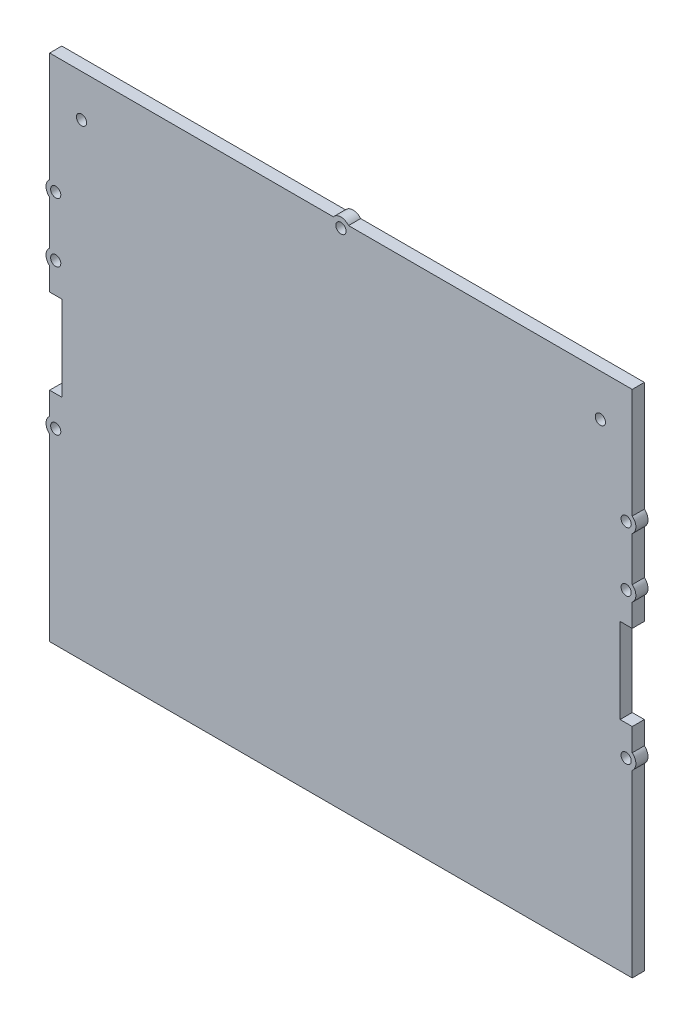
ISO-10303-21;
HEADER;
FILE_DESCRIPTION(('STEP AP214'),'2;1');
FILE_NAME('part.step','',(''),(''),'','','');
FILE_SCHEMA(('AUTOMOTIVE_DESIGN { 1 0 10303 214 1 1 1 1 }'));
ENDSEC;
DATA;
#1=APPLICATION_CONTEXT('core data for automotive mechanical design processes');
#2=APPLICATION_PROTOCOL_DEFINITION('international standard','automotive_design',2000,#1);
#3=PRODUCT_CONTEXT('',#1,'mechanical');
#4=PRODUCT('Part','Part','',(#3));
#5=PRODUCT_RELATED_PRODUCT_CATEGORY('part','',(#4));
#6=PRODUCT_DEFINITION_FORMATION('','',#4);
#7=PRODUCT_DEFINITION_CONTEXT('part definition',#1,'design');
#8=PRODUCT_DEFINITION('design','',#6,#7);
#9=PRODUCT_DEFINITION_SHAPE('','',#8);
#10=(LENGTH_UNIT() NAMED_UNIT(*) SI_UNIT(.MILLI.,.METRE.));
#11=(NAMED_UNIT(*) PLANE_ANGLE_UNIT() SI_UNIT($,.RADIAN.));
#12=(NAMED_UNIT(*) SI_UNIT($,.STERADIAN.) SOLID_ANGLE_UNIT());
#13=UNCERTAINTY_MEASURE_WITH_UNIT(LENGTH_MEASURE(1.E-05),#10,'distance_accuracy_value','');
#14=(GEOMETRIC_REPRESENTATION_CONTEXT(3) GLOBAL_UNCERTAINTY_ASSIGNED_CONTEXT((#13)) GLOBAL_UNIT_ASSIGNED_CONTEXT((#10,
#11,#12)) REPRESENTATION_CONTEXT('',''));
#15=CARTESIAN_POINT('',(0.,0.,0.));
#16=DIRECTION('',(0.,0.,1.));
#17=DIRECTION('',(1.,0.,0.));
#18=AXIS2_PLACEMENT_3D('',#15,#16,#17);
#19=CARTESIAN_POINT('',(-120.,40.,5.));
#20=DIRECTION('',(1.,0.,0.));
#21=DIRECTION('',(0.,0.,-1.));
#22=AXIS2_PLACEMENT_3D('',#19,#20,#21);
#23=PLANE('',#22);
#24=DIRECTION('',(0.,-1.,0.));
#25=VECTOR('',#24,1.);
#26=CARTESIAN_POINT('',(-120.,40.,0.));
#27=LINE('',#26,#25);
#28=CARTESIAN_POINT('',(-120.,105.,0.));
#29=VERTEX_POINT('',#28);
#30=CARTESIAN_POINT('',(-120.,59.7824514060019,0.));
#31=VERTEX_POINT('',#30);
#32=EDGE_CURVE('E218',#29,#31,#27,.T.);
#33=ORIENTED_EDGE('',*,*,#32,.T.);
#34=DIRECTION('',(0.,0.,1.));
#35=VECTOR('',#34,1.);
#36=CARTESIAN_POINT('',(-120.,59.7824514060019,0.));
#37=LINE('',#36,#35);
#38=CARTESIAN_POINT('',(-120.,59.7824514060019,5.));
#39=VERTEX_POINT('',#38);
#40=EDGE_CURVE('E56',#31,#39,#37,.T.);
#41=ORIENTED_EDGE('',*,*,#40,.T.);
#42=DIRECTION('',(0.,-1.,0.));
#43=VECTOR('',#42,1.);
#44=CARTESIAN_POINT('',(-120.,-40.,5.));
#45=LINE('',#44,#43);
#46=CARTESIAN_POINT('',(-120.,105.,5.));
#47=VERTEX_POINT('',#46);
#48=EDGE_CURVE('E406',#47,#39,#45,.T.);
#49=ORIENTED_EDGE('',*,*,#48,.F.);
#50=DIRECTION('',(0.,0.,-1.));
#51=VECTOR('',#50,1.);
#52=CARTESIAN_POINT('',(-120.,105.,5.));
#53=LINE('',#52,#51);
#54=EDGE_CURVE('E421',#47,#29,#53,.T.);
#55=ORIENTED_EDGE('',*,*,#54,.T.);
#56=EDGE_LOOP('',(#33,#41,#49,#55));
#57=FACE_BOUND('',#56,.T.);
#58=ADVANCED_FACE('F33',(#57),#23,.F.);
#59=CARTESIAN_POINT('',(-120.,53.5374534076008,5.));
#60=VERTEX_POINT('',#59);
#61=CARTESIAN_POINT('',(-120.,35.3372333567552,5.));
#62=VERTEX_POINT('',#61);
#63=EDGE_CURVE('E48',#60,#62,#45,.T.);
#64=ORIENTED_EDGE('',*,*,#63,.F.);
#65=DIRECTION('',(0.,0.,1.));
#66=VECTOR('',#65,1.);
#67=CARTESIAN_POINT('',(-120.,53.5374534076008,0.));
#68=LINE('',#67,#66);
#69=CARTESIAN_POINT('',(-120.,53.5374534076008,0.));
#70=VERTEX_POINT('',#69);
#71=EDGE_CURVE('E221',#70,#60,#68,.T.);
#72=ORIENTED_EDGE('',*,*,#71,.F.);
#73=CARTESIAN_POINT('',(-120.,35.3372333567552,0.));
#74=VERTEX_POINT('',#73);
#75=EDGE_CURVE('E208',#70,#74,#27,.T.);
#76=ORIENTED_EDGE('',*,*,#75,.T.);
#77=DIRECTION('',(0.,0.,1.));
#78=VECTOR('',#77,1.);
#79=CARTESIAN_POINT('',(-120.,35.3372333567552,0.));
#80=LINE('',#79,#78);
#81=EDGE_CURVE('E238',#74,#62,#80,.T.);
#82=ORIENTED_EDGE('',*,*,#81,.T.);
#83=EDGE_LOOP('',(#64,#72,#76,#82));
#84=FACE_BOUND('',#83,.T.);
#85=ADVANCED_FACE('F222',(#84),#23,.F.);
#86=CARTESIAN_POINT('',(-120.,-15.2852656424439,0.));
#87=VERTEX_POINT('',#86);
#88=CARTESIAN_POINT('',(-120.,-24.6627666432447,0.));
#89=VERTEX_POINT('',#88);
#90=EDGE_CURVE('E434',#87,#89,#27,.T.);
#91=ORIENTED_EDGE('',*,*,#90,.T.);
#92=DIRECTION('',(0.,0.,1.));
#93=VECTOR('',#92,1.);
#94=CARTESIAN_POINT('',(-120.,-24.6627666432447,0.));
#95=LINE('',#94,#93);
#96=CARTESIAN_POINT('',(-120.,-24.6627666432447,5.));
#97=VERTEX_POINT('',#96);
#98=EDGE_CURVE('E249',#89,#97,#95,.T.);
#99=ORIENTED_EDGE('',*,*,#98,.T.);
#100=CARTESIAN_POINT('',(-120.,-15.2852656424439,5.));
#101=VERTEX_POINT('',#100);
#102=EDGE_CURVE('E409',#101,#97,#45,.T.);
#103=ORIENTED_EDGE('',*,*,#102,.F.);
#104=DIRECTION('',(0.,0.,1.));
#105=VECTOR('',#104,1.);
#106=CARTESIAN_POINT('',(-120.,-15.2852656424439,0.));
#107=LINE('',#106,#105);
#108=EDGE_CURVE('E359',#87,#101,#107,.T.);
#109=ORIENTED_EDGE('',*,*,#108,.F.);
#110=EDGE_LOOP('',(#91,#99,#103,#109));
#111=FACE_BOUND('',#110,.T.);
#112=ADVANCED_FACE('F485',(#111),#23,.F.);
#113=CARTESIAN_POINT('',(120.,105.,5.));
#114=DIRECTION('',(0.,-1.,0.));
#115=DIRECTION('',(1.,0.,0.));
#116=AXIS2_PLACEMENT_3D('',#113,#114,#115);
#117=PLANE('',#116);
#118=DIRECTION('',(-1.,0.,0.));
#119=VECTOR('',#118,1.);
#120=CARTESIAN_POINT('',(120.,105.,0.));
#121=LINE('',#120,#119);
#122=CARTESIAN_POINT('',(120.,105.,0.));
#123=VERTEX_POINT('',#122);
#124=CARTESIAN_POINT('',(3.12249899919924,105.,0.));
#125=VERTEX_POINT('',#124);
#126=EDGE_CURVE('E430',#123,#125,#121,.T.);
#127=ORIENTED_EDGE('',*,*,#126,.T.);
#128=DIRECTION('',(0.,0.,1.));
#129=VECTOR('',#128,1.);
#130=CARTESIAN_POINT('',(3.12249899919923,105.,0.));
#131=LINE('',#130,#129);
#132=CARTESIAN_POINT('',(3.12249899919924,105.,5.));
#133=VERTEX_POINT('',#132);
#134=EDGE_CURVE('E260',#125,#133,#131,.T.);
#135=ORIENTED_EDGE('',*,*,#134,.T.);
#136=DIRECTION('',(-1.,0.,0.));
#137=VECTOR('',#136,1.);
#138=CARTESIAN_POINT('',(120.,105.,5.));
#139=LINE('',#138,#137);
#140=CARTESIAN_POINT('',(120.,105.,5.));
#141=VERTEX_POINT('',#140);
#142=EDGE_CURVE('E418',#141,#133,#139,.T.);
#143=ORIENTED_EDGE('',*,*,#142,.F.);
#144=DIRECTION('',(0.,0.,-1.));
#145=VECTOR('',#144,1.);
#146=CARTESIAN_POINT('',(120.,105.,5.));
#147=LINE('',#146,#145);
#148=EDGE_CURVE('E437',#141,#123,#147,.T.);
#149=ORIENTED_EDGE('',*,*,#148,.T.);
#150=EDGE_LOOP('',(#127,#135,#143,#149));
#151=FACE_BOUND('',#150,.T.);
#152=ADVANCED_FACE('F502',(#151),#117,.F.);
#153=CARTESIAN_POINT('',(120.,105.,5.));
#154=DIRECTION('',(-1.,0.,0.));
#155=DIRECTION('',(0.,-1.,0.));
#156=AXIS2_PLACEMENT_3D('',#153,#154,#155);
#157=PLANE('',#156);
#158=DIRECTION('',(0.,1.,0.));
#159=VECTOR('',#158,1.);
#160=CARTESIAN_POINT('',(120.,105.,0.));
#161=LINE('',#160,#159);
#162=CARTESIAN_POINT('',(120.,-105.,0.));
#163=VERTEX_POINT('',#162);
#164=CARTESIAN_POINT('',(120.,-30.9077646416431,0.));
#165=VERTEX_POINT('',#164);
#166=EDGE_CURVE('E425',#163,#165,#161,.T.);
#167=ORIENTED_EDGE('',*,*,#166,.T.);
#168=DIRECTION('',(0.,0.,1.));
#169=VECTOR('',#168,1.);
#170=CARTESIAN_POINT('',(120.,-30.9077646416431,0.));
#171=LINE('',#170,#169);
#172=CARTESIAN_POINT('',(120.,-30.9077646416431,5.));
#173=VERTEX_POINT('',#172);
#174=EDGE_CURVE('E271',#165,#173,#171,.T.);
#175=ORIENTED_EDGE('',*,*,#174,.T.);
#176=DIRECTION('',(0.,1.,0.));
#177=VECTOR('',#176,1.);
#178=CARTESIAN_POINT('',(120.,-40.,5.));
#179=LINE('',#178,#177);
#180=CARTESIAN_POINT('',(120.,-105.,5.));
#181=VERTEX_POINT('',#180);
#182=EDGE_CURVE('E412',#181,#173,#179,.T.);
#183=ORIENTED_EDGE('',*,*,#182,.F.);
#184=DIRECTION('',(0.,0.,-1.));
#185=VECTOR('',#184,1.);
#186=CARTESIAN_POINT('',(120.,-105.,5.));
#187=LINE('',#186,#185);
#188=EDGE_CURVE('E41',#181,#163,#187,.T.);
#189=ORIENTED_EDGE('',*,*,#188,.T.);
#190=EDGE_LOOP('',(#167,#175,#183,#189));
#191=FACE_BOUND('',#190,.T.);
#192=ADVANCED_FACE('F443',(#191),#157,.F.);
#193=CARTESIAN_POINT('',(120.,19.7147343575561,0.));
#194=VERTEX_POINT('',#193);
#195=CARTESIAN_POINT('',(120.,29.0922353583569,0.));
#196=VERTEX_POINT('',#195);
#197=EDGE_CURVE('E429',#194,#196,#161,.T.);
#198=ORIENTED_EDGE('',*,*,#197,.T.);
#199=DIRECTION('',(0.,0.,1.));
#200=VECTOR('',#199,1.);
#201=CARTESIAN_POINT('',(120.,29.0922353583569,0.));
#202=LINE('',#201,#200);
#203=CARTESIAN_POINT('',(120.,29.0922353583569,5.));
#204=VERTEX_POINT('',#203);
#205=EDGE_CURVE('E282',#196,#204,#202,.T.);
#206=ORIENTED_EDGE('',*,*,#205,.T.);
#207=CARTESIAN_POINT('',(120.,19.7147343575561,5.));
#208=VERTEX_POINT('',#207);
#209=EDGE_CURVE('E417',#208,#204,#179,.T.);
#210=ORIENTED_EDGE('',*,*,#209,.F.);
#211=DIRECTION('',(0.,0.,1.));
#212=VECTOR('',#211,1.);
#213=CARTESIAN_POINT('',(120.,19.7147343575561,0.));
#214=LINE('',#213,#212);
#215=EDGE_CURVE('E316',#194,#208,#214,.T.);
#216=ORIENTED_EDGE('',*,*,#215,.F.);
#217=EDGE_LOOP('',(#198,#206,#210,#216));
#218=FACE_BOUND('',#217,.T.);
#219=ADVANCED_FACE('F813',(#218),#157,.F.);
#220=CARTESIAN_POINT('',(120.,35.3372333567553,5.));
#221=VERTEX_POINT('',#220);
#222=CARTESIAN_POINT('',(120.,53.5374534076009,5.));
#223=VERTEX_POINT('',#222);
#224=EDGE_CURVE('E799',#221,#223,#179,.T.);
#225=ORIENTED_EDGE('',*,*,#224,.F.);
#226=DIRECTION('',(0.,0.,1.));
#227=VECTOR('',#226,1.);
#228=CARTESIAN_POINT('',(120.,35.3372333567553,0.));
#229=LINE('',#228,#227);
#230=CARTESIAN_POINT('',(120.,35.3372333567553,0.));
#231=VERTEX_POINT('',#230);
#232=EDGE_CURVE('E279',#231,#221,#229,.T.);
#233=ORIENTED_EDGE('',*,*,#232,.F.);
#234=CARTESIAN_POINT('',(120.,53.5374534076009,0.));
#235=VERTEX_POINT('',#234);
#236=EDGE_CURVE('E794',#231,#235,#161,.T.);
#237=ORIENTED_EDGE('',*,*,#236,.T.);
#238=DIRECTION('',(0.,0.,1.));
#239=VECTOR('',#238,1.);
#240=CARTESIAN_POINT('',(120.,53.5374534076009,0.));
#241=LINE('',#240,#239);
#242=EDGE_CURVE('E293',#235,#223,#241,.T.);
#243=ORIENTED_EDGE('',*,*,#242,.T.);
#244=EDGE_LOOP('',(#225,#233,#237,#243));
#245=FACE_BOUND('',#244,.T.);
#246=ADVANCED_FACE('F511',(#245),#157,.F.);
#247=CARTESIAN_POINT('',(120.,59.7824514060019,5.));
#248=VERTEX_POINT('',#247);
#249=EDGE_CURVE('E411',#248,#141,#179,.T.);
#250=ORIENTED_EDGE('',*,*,#249,.F.);
#251=DIRECTION('',(0.,0.,1.));
#252=VECTOR('',#251,1.);
#253=CARTESIAN_POINT('',(120.,59.782451406002,0.));
#254=LINE('',#253,#252);
#255=CARTESIAN_POINT('',(120.,59.782451406002,0.));
#256=VERTEX_POINT('',#255);
#257=EDGE_CURVE('E290',#256,#248,#254,.T.);
#258=ORIENTED_EDGE('',*,*,#257,.F.);
#259=EDGE_CURVE('E424',#256,#123,#161,.T.);
#260=ORIENTED_EDGE('',*,*,#259,.T.);
#261=ORIENTED_EDGE('',*,*,#148,.F.);
#262=EDGE_LOOP('',(#250,#258,#260,#261));
#263=FACE_BOUND('',#262,.T.);
#264=ADVANCED_FACE('F506',(#263),#157,.F.);
#265=CARTESIAN_POINT('',(-120.,29.0922353583569,5.));
#266=VERTEX_POINT('',#265);
#267=CARTESIAN_POINT('',(-120.,19.7147343575561,5.));
#268=VERTEX_POINT('',#267);
#269=EDGE_CURVE('E462',#266,#268,#45,.T.);
#270=ORIENTED_EDGE('',*,*,#269,.F.);
#271=DIRECTION('',(0.,0.,1.));
#272=VECTOR('',#271,1.);
#273=CARTESIAN_POINT('',(-120.,29.0922353583569,0.));
#274=LINE('',#273,#272);
#275=CARTESIAN_POINT('',(-120.,29.0922353583569,0.));
#276=VERTEX_POINT('',#275);
#277=EDGE_CURVE('E235',#276,#266,#274,.T.);
#278=ORIENTED_EDGE('',*,*,#277,.F.);
#279=CARTESIAN_POINT('',(-120.,19.7147343575561,0.));
#280=VERTEX_POINT('',#279);
#281=EDGE_CURVE('E219',#276,#280,#27,.T.);
#282=ORIENTED_EDGE('',*,*,#281,.T.);
#283=DIRECTION('',(0.,0.,1.));
#284=VECTOR('',#283,1.);
#285=CARTESIAN_POINT('',(-120.,19.7147343575561,0.));
#286=LINE('',#285,#284);
#287=EDGE_CURVE('E367',#280,#268,#286,.T.);
#288=ORIENTED_EDGE('',*,*,#287,.T.);
#289=EDGE_LOOP('',(#270,#278,#282,#288));
#290=FACE_BOUND('',#289,.T.);
#291=ADVANCED_FACE('F469',(#290),#23,.F.);
#292=CARTESIAN_POINT('',(120.,-105.,5.));
#293=DIRECTION('',(0.,1.,0.));
#294=DIRECTION('',(-1.,0.,0.));
#295=AXIS2_PLACEMENT_3D('',#292,#293,#294);
#296=PLANE('',#295);
#297=DIRECTION('',(1.,0.,0.));
#298=VECTOR('',#297,1.);
#299=CARTESIAN_POINT('',(120.,-105.,0.));
#300=LINE('',#299,#298);
#301=CARTESIAN_POINT('',(-120.,-105.,0.));
#302=VERTEX_POINT('',#301);
#303=EDGE_CURVE('E379',#302,#163,#300,.T.);
#304=ORIENTED_EDGE('',*,*,#303,.T.);
#305=ORIENTED_EDGE('',*,*,#188,.F.);
#306=DIRECTION('',(1.,0.,0.));
#307=VECTOR('',#306,1.);
#308=CARTESIAN_POINT('',(120.,-105.,5.));
#309=LINE('',#308,#307);
#310=CARTESIAN_POINT('',(-120.,-105.,5.));
#311=VERTEX_POINT('',#310);
#312=EDGE_CURVE('E408',#311,#181,#309,.T.);
#313=ORIENTED_EDGE('',*,*,#312,.F.);
#314=DIRECTION('',(0.,0.,-1.));
#315=VECTOR('',#314,1.);
#316=CARTESIAN_POINT('',(-120.,-105.,5.));
#317=LINE('',#316,#315);
#318=EDGE_CURVE('E11',#311,#302,#317,.T.);
#319=ORIENTED_EDGE('',*,*,#318,.T.);
#320=EDGE_LOOP('',(#304,#305,#313,#319));
#321=FACE_BOUND('',#320,.T.);
#322=ADVANCED_FACE('F35',(#321),#296,.F.);
#323=CARTESIAN_POINT('',(120.,-24.6627666432447,5.));
#324=VERTEX_POINT('',#323);
#325=CARTESIAN_POINT('',(120.,-15.2852656424439,5.));
#326=VERTEX_POINT('',#325);
#327=EDGE_CURVE('E416',#324,#326,#179,.T.);
#328=ORIENTED_EDGE('',*,*,#327,.F.);
#329=DIRECTION('',(0.,0.,1.));
#330=VECTOR('',#329,1.);
#331=CARTESIAN_POINT('',(120.,-24.6627666432447,0.));
#332=LINE('',#331,#330);
#333=CARTESIAN_POINT('',(120.,-24.6627666432447,0.));
#334=VERTEX_POINT('',#333);
#335=EDGE_CURVE('E268',#334,#324,#332,.T.);
#336=ORIENTED_EDGE('',*,*,#335,.F.);
#337=CARTESIAN_POINT('',(120.,-15.2852656424439,0.));
#338=VERTEX_POINT('',#337);
#339=EDGE_CURVE('E428',#334,#338,#161,.T.);
#340=ORIENTED_EDGE('',*,*,#339,.T.);
#341=DIRECTION('',(0.,0.,1.));
#342=VECTOR('',#341,1.);
#343=CARTESIAN_POINT('',(120.,-15.2852656424439,0.));
#344=LINE('',#343,#342);
#345=EDGE_CURVE('E319',#338,#326,#344,.T.);
#346=ORIENTED_EDGE('',*,*,#345,.T.);
#347=EDGE_LOOP('',(#328,#336,#340,#346));
#348=FACE_BOUND('',#347,.T.);
#349=ADVANCED_FACE('F499',(#348),#157,.F.);
#350=CARTESIAN_POINT('',(-3.12249899919922,105.,5.));
#351=VERTEX_POINT('',#350);
#352=EDGE_CURVE('E415',#351,#47,#139,.T.);
#353=ORIENTED_EDGE('',*,*,#352,.F.);
#354=DIRECTION('',(0.,0.,1.));
#355=VECTOR('',#354,1.);
#356=CARTESIAN_POINT('',(-3.12249899919923,105.,0.));
#357=LINE('',#356,#355);
#358=CARTESIAN_POINT('',(-3.12249899919923,105.,0.));
#359=VERTEX_POINT('',#358);
#360=EDGE_CURVE('E257',#359,#351,#357,.T.);
#361=ORIENTED_EDGE('',*,*,#360,.F.);
#362=EDGE_CURVE('E427',#359,#29,#121,.T.);
#363=ORIENTED_EDGE('',*,*,#362,.T.);
#364=ORIENTED_EDGE('',*,*,#54,.F.);
#365=EDGE_LOOP('',(#353,#361,#363,#364));
#366=FACE_BOUND('',#365,.T.);
#367=ADVANCED_FACE('F491',(#366),#117,.F.);
#368=CARTESIAN_POINT('',(-120.,-30.9077646416431,5.));
#369=VERTEX_POINT('',#368);
#370=EDGE_CURVE('E433',#369,#311,#45,.T.);
#371=ORIENTED_EDGE('',*,*,#370,.F.);
#372=DIRECTION('',(0.,0.,1.));
#373=VECTOR('',#372,1.);
#374=CARTESIAN_POINT('',(-120.,-30.9077646416431,0.));
#375=LINE('',#374,#373);
#376=CARTESIAN_POINT('',(-120.,-30.9077646416431,0.));
#377=VERTEX_POINT('',#376);
#378=EDGE_CURVE('E246',#377,#369,#375,.T.);
#379=ORIENTED_EDGE('',*,*,#378,.F.);
#380=EDGE_CURVE('E431',#377,#302,#27,.T.);
#381=ORIENTED_EDGE('',*,*,#380,.T.);
#382=ORIENTED_EDGE('',*,*,#318,.F.);
#383=EDGE_LOOP('',(#371,#379,#381,#382));
#384=FACE_BOUND('',#383,.T.);
#385=ADVANCED_FACE('F489',(#384),#23,.F.);
#386=CARTESIAN_POINT('',(0.,0.,5.));
#387=DIRECTION('',(0.,0.,-1.));
#388=DIRECTION('',(-1.,0.,0.));
#389=AXIS2_PLACEMENT_3D('',#386,#387,#388);
#390=PLANE('',#389);
#391=CARTESIAN_POINT('',(-117.5,32.2147343575561,5.));
#392=DIRECTION('',(0.,0.,1.));
#393=DIRECTION('',(1.,0.,0.));
#394=AXIS2_PLACEMENT_3D('',#391,#392,#393);
#395=CIRCLE('',#394,2.1);
#396=CARTESIAN_POINT('',(-115.4,32.2147343575561,5.));
#397=VERTEX_POINT('',#396);
#398=EDGE_CURVE('E329',#397,#397,#395,.T.);
#399=ORIENTED_EDGE('',*,*,#398,.F.);
#400=EDGE_LOOP('',(#399));
#401=FACE_BOUND('',#400,.T.);
#402=CARTESIAN_POINT('',(-117.5,-27.7852656424439,5.));
#403=DIRECTION('',(0.,0.,1.));
#404=DIRECTION('',(1.,0.,0.));
#405=AXIS2_PLACEMENT_3D('',#402,#403,#404);
#406=CIRCLE('',#405,2.1);
#407=CARTESIAN_POINT('',(-115.4,-27.7852656424439,5.));
#408=VERTEX_POINT('',#407);
#409=EDGE_CURVE('E335',#408,#408,#406,.T.);
#410=ORIENTED_EDGE('',*,*,#409,.F.);
#411=EDGE_LOOP('',(#410));
#412=FACE_BOUND('',#411,.T.);
#413=CARTESIAN_POINT('',(117.5,-27.7852656424439,5.));
#414=DIRECTION('',(0.,0.,1.));
#415=DIRECTION('',(-1.,0.,0.));
#416=AXIS2_PLACEMENT_3D('',#413,#414,#415);
#417=CIRCLE('',#416,2.1);
#418=CARTESIAN_POINT('',(115.4,-27.7852656424439,5.));
#419=VERTEX_POINT('',#418);
#420=EDGE_CURVE('E341',#419,#419,#417,.T.);
#421=ORIENTED_EDGE('',*,*,#420,.F.);
#422=EDGE_LOOP('',(#421));
#423=FACE_BOUND('',#422,.T.);
#424=CARTESIAN_POINT('',(117.5,32.2147343575561,5.));
#425=DIRECTION('',(0.,0.,1.));
#426=DIRECTION('',(-1.,0.,0.));
#427=AXIS2_PLACEMENT_3D('',#424,#425,#426);
#428=CIRCLE('',#427,2.1);
#429=CARTESIAN_POINT('',(115.4,32.2147343575561,5.));
#430=VERTEX_POINT('',#429);
#431=EDGE_CURVE('E318',#430,#430,#428,.T.);
#432=ORIENTED_EDGE('',*,*,#431,.F.);
#433=EDGE_LOOP('',(#432));
#434=FACE_BOUND('',#433,.T.);
#435=CARTESIAN_POINT('',(117.5,56.6599524068014,5.));
#436=DIRECTION('',(0.,0.,1.));
#437=DIRECTION('',(1.,0.,0.));
#438=AXIS2_PLACEMENT_3D('',#435,#436,#437);
#439=CIRCLE('',#438,2.09999999999948);
#440=CARTESIAN_POINT('',(119.599999999999,56.6599524068014,5.));
#441=VERTEX_POINT('',#440);
#442=EDGE_CURVE('E380',#441,#441,#439,.T.);
#443=ORIENTED_EDGE('',*,*,#442,.F.);
#444=EDGE_LOOP('',(#443));
#445=FACE_BOUND('',#444,.T.);
#446=CARTESIAN_POINT('',(106.863886883417,87.7262965458875,5.));
#447=DIRECTION('',(0.,0.,1.));
#448=DIRECTION('',(1.,0.,0.));
#449=AXIS2_PLACEMENT_3D('',#446,#447,#448);
#450=CIRCLE('',#449,2.10000000000012);
#451=CARTESIAN_POINT('',(108.963886883417,87.7262965458875,5.));
#452=VERTEX_POINT('',#451);
#453=EDGE_CURVE('E386',#452,#452,#450,.T.);
#454=ORIENTED_EDGE('',*,*,#453,.F.);
#455=EDGE_LOOP('',(#454));
#456=FACE_BOUND('',#455,.T.);
#457=CARTESIAN_POINT('',(0.,102.5,5.));
#458=DIRECTION('',(0.,0.,1.));
#459=DIRECTION('',(1.,0.,0.));
#460=AXIS2_PLACEMENT_3D('',#457,#458,#459);
#461=CIRCLE('',#460,2.10000000000002);
#462=CARTESIAN_POINT('',(2.09999999999998,102.5,5.));
#463=VERTEX_POINT('',#462);
#464=EDGE_CURVE('E392',#463,#463,#461,.T.);
#465=ORIENTED_EDGE('',*,*,#464,.F.);
#466=EDGE_LOOP('',(#465));
#467=FACE_BOUND('',#466,.T.);
#468=CARTESIAN_POINT('',(-117.5,56.6599524068014,5.));
#469=DIRECTION('',(0.,0.,1.));
#470=DIRECTION('',(1.,0.,0.));
#471=AXIS2_PLACEMENT_3D('',#468,#469,#470);
#472=CIRCLE('',#471,2.09999999999948);
#473=CARTESIAN_POINT('',(-115.400000000001,56.6599524068014,5.));
#474=VERTEX_POINT('',#473);
#475=EDGE_CURVE('E398',#474,#474,#472,.T.);
#476=ORIENTED_EDGE('',*,*,#475,.F.);
#477=EDGE_LOOP('',(#476));
#478=FACE_BOUND('',#477,.T.);
#479=CARTESIAN_POINT('',(-106.863886883417,87.7262965458875,5.));
#480=DIRECTION('',(0.,0.,1.));
#481=DIRECTION('',(1.,0.,0.));
#482=AXIS2_PLACEMENT_3D('',#479,#480,#481);
#483=CIRCLE('',#482,2.09999999999987);
#484=CARTESIAN_POINT('',(-104.763886883417,87.7262965458875,5.));
#485=VERTEX_POINT('',#484);
#486=EDGE_CURVE('E370',#485,#485,#483,.T.);
#487=ORIENTED_EDGE('',*,*,#486,.F.);
#488=EDGE_LOOP('',(#487));
#489=FACE_BOUND('',#488,.T.);
#490=DIRECTION('',(0.,-1.,0.));
#491=VECTOR('',#490,1.);
#492=CARTESIAN_POINT('',(115.,19.7147343575561,5.));
#493=LINE('',#492,#491);
#494=CARTESIAN_POINT('',(115.,19.7147343575561,5.));
#495=VERTEX_POINT('',#494);
#496=CARTESIAN_POINT('',(115.,-15.2852656424439,5.));
#497=VERTEX_POINT('',#496);
#498=EDGE_CURVE('E311',#495,#497,#493,.T.);
#499=ORIENTED_EDGE('',*,*,#498,.F.);
#500=DIRECTION('',(-1.,0.,0.));
#501=VECTOR('',#500,1.);
#502=CARTESIAN_POINT('',(120.,19.7147343575561,5.));
#503=LINE('',#502,#501);
#504=EDGE_CURVE('E296',#208,#495,#503,.T.);
#505=ORIENTED_EDGE('',*,*,#504,.F.);
#506=ORIENTED_EDGE('',*,*,#209,.T.);
#507=CARTESIAN_POINT('',(117.5,32.2147343575561,5.));
#508=DIRECTION('',(0.,0.,1.));
#509=DIRECTION('',(1.,0.,0.));
#510=AXIS2_PLACEMENT_3D('',#507,#508,#509);
#511=CIRCLE('',#510,4.);
#512=EDGE_CURVE('E273',#204,#221,#511,.T.);
#513=ORIENTED_EDGE('',*,*,#512,.T.);
#514=ORIENTED_EDGE('',*,*,#224,.T.);
#515=CARTESIAN_POINT('',(117.5,56.6599524068001,5.));
#516=DIRECTION('',(0.,0.,1.));
#517=DIRECTION('',(1.,0.,0.));
#518=AXIS2_PLACEMENT_3D('',#515,#516,#517);
#519=CIRCLE('',#518,4.00000000000109);
#520=EDGE_CURVE('E284',#223,#248,#519,.T.);
#521=ORIENTED_EDGE('',*,*,#520,.T.);
#522=ORIENTED_EDGE('',*,*,#249,.T.);
#523=ORIENTED_EDGE('',*,*,#142,.T.);
#524=CARTESIAN_POINT('',(0.,102.5,5.));
#525=DIRECTION('',(0.,0.,1.));
#526=DIRECTION('',(1.,0.,0.));
#527=AXIS2_PLACEMENT_3D('',#524,#525,#526);
#528=CIRCLE('',#527,4.);
#529=EDGE_CURVE('E251',#133,#351,#528,.T.);
#530=ORIENTED_EDGE('',*,*,#529,.T.);
#531=ORIENTED_EDGE('',*,*,#352,.T.);
#532=ORIENTED_EDGE('',*,*,#48,.T.);
#533=CARTESIAN_POINT('',(-117.5,56.6599524068,5.));
#534=DIRECTION('',(0.,0.,1.));
#535=DIRECTION('',(-1.,0.,0.));
#536=AXIS2_PLACEMENT_3D('',#533,#534,#535);
#537=CIRCLE('',#536,4.00000000000109);
#538=EDGE_CURVE('E228',#39,#60,#537,.T.);
#539=ORIENTED_EDGE('',*,*,#538,.T.);
#540=ORIENTED_EDGE('',*,*,#63,.T.);
#541=CARTESIAN_POINT('',(-117.5,32.2147343575561,5.));
#542=DIRECTION('',(0.,0.,1.));
#543=DIRECTION('',(-1.,0.,0.));
#544=AXIS2_PLACEMENT_3D('',#541,#542,#543);
#545=CIRCLE('',#544,4.);
#546=EDGE_CURVE('E232',#62,#266,#545,.T.);
#547=ORIENTED_EDGE('',*,*,#546,.T.);
#548=ORIENTED_EDGE('',*,*,#269,.T.);
#549=DIRECTION('',(-1.,0.,0.));
#550=VECTOR('',#549,1.);
#551=CARTESIAN_POINT('',(-120.,19.7147343575561,5.));
#552=LINE('',#551,#550);
#553=CARTESIAN_POINT('',(-115.,19.7147343575561,5.));
#554=VERTEX_POINT('',#553);
#555=EDGE_CURVE('E353',#554,#268,#552,.T.);
#556=ORIENTED_EDGE('',*,*,#555,.F.);
#557=DIRECTION('',(0.,1.,0.));
#558=VECTOR('',#557,1.);
#559=CARTESIAN_POINT('',(-115.,19.7147343575561,5.));
#560=LINE('',#559,#558);
#561=CARTESIAN_POINT('',(-115.,-15.2852656424439,5.));
#562=VERTEX_POINT('',#561);
#563=EDGE_CURVE('E362',#562,#554,#560,.T.);
#564=ORIENTED_EDGE('',*,*,#563,.F.);
#565=DIRECTION('',(1.,0.,0.));
#566=VECTOR('',#565,1.);
#567=CARTESIAN_POINT('',(-120.,-15.2852656424439,5.));
#568=LINE('',#567,#566);
#569=EDGE_CURVE('E328',#101,#562,#568,.T.);
#570=ORIENTED_EDGE('',*,*,#569,.F.);
#571=ORIENTED_EDGE('',*,*,#102,.T.);
#572=CARTESIAN_POINT('',(-117.5,-27.7852656424439,5.));
#573=DIRECTION('',(0.,0.,1.));
#574=DIRECTION('',(-1.,0.,0.));
#575=AXIS2_PLACEMENT_3D('',#572,#573,#574);
#576=CIRCLE('',#575,4.);
#577=EDGE_CURVE('E240',#97,#369,#576,.T.);
#578=ORIENTED_EDGE('',*,*,#577,.T.);
#579=ORIENTED_EDGE('',*,*,#370,.T.);
#580=ORIENTED_EDGE('',*,*,#312,.T.);
#581=ORIENTED_EDGE('',*,*,#182,.T.);
#582=CARTESIAN_POINT('',(117.5,-27.7852656424439,5.));
#583=DIRECTION('',(0.,0.,1.));
#584=DIRECTION('',(1.,0.,0.));
#585=AXIS2_PLACEMENT_3D('',#582,#583,#584);
#586=CIRCLE('',#585,4.);
#587=EDGE_CURVE('E262',#173,#324,#586,.T.);
#588=ORIENTED_EDGE('',*,*,#587,.T.);
#589=ORIENTED_EDGE('',*,*,#327,.T.);
#590=DIRECTION('',(1.,0.,0.));
#591=VECTOR('',#590,1.);
#592=CARTESIAN_POINT('',(120.,-15.2852656424439,5.));
#593=LINE('',#592,#591);
#594=EDGE_CURVE('E302',#497,#326,#593,.T.);
#595=ORIENTED_EDGE('',*,*,#594,.F.);
#596=EDGE_LOOP('',(#499,#505,#506,#513,#514,#521,#522,#523,#530,#531,#532,#539,#540,#547,#548,
#556,#564,#570,#571,#578,#579,#580,#581,#588,#589,#595));
#597=FACE_BOUND('',#596,.T.);
#598=ADVANCED_FACE('F458',(#401,#412,#423,#434,#445,#456,#467,#478,#489,#597),#390,.F.);
#599=CARTESIAN_POINT('',(0.,0.,0.));
#600=DIRECTION('',(0.,0.,-1.));
#601=DIRECTION('',(-1.,0.,0.));
#602=AXIS2_PLACEMENT_3D('',#599,#600,#601);
#603=PLANE('',#602);
#604=CARTESIAN_POINT('',(-117.5,32.2147343575561,0.));
#605=DIRECTION('',(0.,0.,1.));
#606=DIRECTION('',(1.,0.,0.));
#607=AXIS2_PLACEMENT_3D('',#604,#605,#606);
#608=CIRCLE('',#607,2.1);
#609=CARTESIAN_POINT('',(-115.4,32.2147343575561,0.));
#610=VERTEX_POINT('',#609);
#611=EDGE_CURVE('E325',#610,#610,#608,.T.);
#612=ORIENTED_EDGE('',*,*,#611,.T.);
#613=EDGE_LOOP('',(#612));
#614=FACE_BOUND('',#613,.T.);
#615=CARTESIAN_POINT('',(-117.5,-27.7852656424439,0.));
#616=DIRECTION('',(0.,0.,1.));
#617=DIRECTION('',(1.,0.,0.));
#618=AXIS2_PLACEMENT_3D('',#615,#616,#617);
#619=CIRCLE('',#618,2.1);
#620=CARTESIAN_POINT('',(-115.4,-27.7852656424439,0.));
#621=VERTEX_POINT('',#620);
#622=EDGE_CURVE('E332',#621,#621,#619,.T.);
#623=ORIENTED_EDGE('',*,*,#622,.T.);
#624=EDGE_LOOP('',(#623));
#625=FACE_BOUND('',#624,.T.);
#626=CARTESIAN_POINT('',(117.5,-27.7852656424439,0.));
#627=DIRECTION('',(0.,0.,1.));
#628=DIRECTION('',(-1.,0.,0.));
#629=AXIS2_PLACEMENT_3D('',#626,#627,#628);
#630=CIRCLE('',#629,2.1);
#631=CARTESIAN_POINT('',(115.4,-27.7852656424439,0.));
#632=VERTEX_POINT('',#631);
#633=EDGE_CURVE('E338',#632,#632,#630,.T.);
#634=ORIENTED_EDGE('',*,*,#633,.T.);
#635=EDGE_LOOP('',(#634));
#636=FACE_BOUND('',#635,.T.);
#637=CARTESIAN_POINT('',(117.5,32.2147343575561,0.));
#638=DIRECTION('',(0.,0.,1.));
#639=DIRECTION('',(-1.,0.,0.));
#640=AXIS2_PLACEMENT_3D('',#637,#638,#639);
#641=CIRCLE('',#640,2.1);
#642=CARTESIAN_POINT('',(115.4,32.2147343575561,0.));
#643=VERTEX_POINT('',#642);
#644=EDGE_CURVE('E344',#643,#643,#641,.T.);
#645=ORIENTED_EDGE('',*,*,#644,.T.);
#646=EDGE_LOOP('',(#645));
#647=FACE_BOUND('',#646,.T.);
#648=DIRECTION('',(-1.,0.,0.));
#649=VECTOR('',#648,1.);
#650=CARTESIAN_POINT('',(120.,19.7147343575561,0.));
#651=LINE('',#650,#649);
#652=CARTESIAN_POINT('',(115.,19.7147343575561,0.));
#653=VERTEX_POINT('',#652);
#654=EDGE_CURVE('E299',#194,#653,#651,.T.);
#655=ORIENTED_EDGE('',*,*,#654,.T.);
#656=DIRECTION('',(0.,-1.,0.));
#657=VECTOR('',#656,1.);
#658=CARTESIAN_POINT('',(115.,19.7147343575561,0.));
#659=LINE('',#658,#657);
#660=CARTESIAN_POINT('',(115.,-15.2852656424439,0.));
#661=VERTEX_POINT('',#660);
#662=EDGE_CURVE('E301',#653,#661,#659,.T.);
#663=ORIENTED_EDGE('',*,*,#662,.T.);
#664=DIRECTION('',(1.,0.,0.));
#665=VECTOR('',#664,1.);
#666=CARTESIAN_POINT('',(120.,-15.2852656424439,0.));
#667=LINE('',#666,#665);
#668=EDGE_CURVE('E305',#661,#338,#667,.T.);
#669=ORIENTED_EDGE('',*,*,#668,.T.);
#670=ORIENTED_EDGE('',*,*,#339,.F.);
#671=CARTESIAN_POINT('',(117.5,-27.7852656424439,0.));
#672=DIRECTION('',(0.,0.,1.));
#673=DIRECTION('',(1.,0.,0.));
#674=AXIS2_PLACEMENT_3D('',#671,#672,#673);
#675=CIRCLE('',#674,4.);
#676=EDGE_CURVE('E265',#165,#334,#675,.T.);
#677=ORIENTED_EDGE('',*,*,#676,.F.);
#678=ORIENTED_EDGE('',*,*,#166,.F.);
#679=ORIENTED_EDGE('',*,*,#303,.F.);
#680=ORIENTED_EDGE('',*,*,#380,.F.);
#681=CARTESIAN_POINT('',(-117.5,-27.7852656424439,0.));
#682=DIRECTION('',(0.,0.,1.));
#683=DIRECTION('',(-1.,0.,0.));
#684=AXIS2_PLACEMENT_3D('',#681,#682,#683);
#685=CIRCLE('',#684,4.);
#686=EDGE_CURVE('E243',#89,#377,#685,.T.);
#687=ORIENTED_EDGE('',*,*,#686,.F.);
#688=ORIENTED_EDGE('',*,*,#90,.F.);
#689=DIRECTION('',(1.,0.,0.));
#690=VECTOR('',#689,1.);
#691=CARTESIAN_POINT('',(-120.,-15.2852656424439,0.));
#692=LINE('',#691,#690);
#693=CARTESIAN_POINT('',(-115.,-15.2852656424439,0.));
#694=VERTEX_POINT('',#693);
#695=EDGE_CURVE('E349',#87,#694,#692,.T.);
#696=ORIENTED_EDGE('',*,*,#695,.T.);
#697=DIRECTION('',(0.,1.,0.));
#698=VECTOR('',#697,1.);
#699=CARTESIAN_POINT('',(-115.,19.7147343575561,0.));
#700=LINE('',#699,#698);
#701=CARTESIAN_POINT('',(-115.,19.7147343575561,0.));
#702=VERTEX_POINT('',#701);
#703=EDGE_CURVE('E352',#694,#702,#700,.T.);
#704=ORIENTED_EDGE('',*,*,#703,.T.);
#705=DIRECTION('',(-1.,0.,0.));
#706=VECTOR('',#705,1.);
#707=CARTESIAN_POINT('',(-120.,19.7147343575561,0.));
#708=LINE('',#707,#706);
#709=EDGE_CURVE('E356',#702,#280,#708,.T.);
#710=ORIENTED_EDGE('',*,*,#709,.T.);
#711=ORIENTED_EDGE('',*,*,#281,.F.);
#712=CARTESIAN_POINT('',(-117.5,32.2147343575561,0.));
#713=DIRECTION('',(0.,0.,1.));
#714=DIRECTION('',(-1.,0.,0.));
#715=AXIS2_PLACEMENT_3D('',#712,#713,#714);
#716=CIRCLE('',#715,4.);
#717=EDGE_CURVE('E216',#74,#276,#716,.T.);
#718=ORIENTED_EDGE('',*,*,#717,.F.);
#719=ORIENTED_EDGE('',*,*,#75,.F.);
#720=CARTESIAN_POINT('',(-117.5,56.6599524068,0.));
#721=DIRECTION('',(0.,0.,1.));
#722=DIRECTION('',(-1.,0.,0.));
#723=AXIS2_PLACEMENT_3D('',#720,#721,#722);
#724=CIRCLE('',#723,4.00000000000109);
#725=EDGE_CURVE('E214',#31,#70,#724,.T.);
#726=ORIENTED_EDGE('',*,*,#725,.F.);
#727=ORIENTED_EDGE('',*,*,#32,.F.);
#728=ORIENTED_EDGE('',*,*,#362,.F.);
#729=CARTESIAN_POINT('',(0.,102.5,0.));
#730=DIRECTION('',(0.,0.,1.));
#731=DIRECTION('',(1.,0.,0.));
#732=AXIS2_PLACEMENT_3D('',#729,#730,#731);
#733=CIRCLE('',#732,4.);
#734=EDGE_CURVE('E254',#125,#359,#733,.T.);
#735=ORIENTED_EDGE('',*,*,#734,.F.);
#736=ORIENTED_EDGE('',*,*,#126,.F.);
#737=ORIENTED_EDGE('',*,*,#259,.F.);
#738=CARTESIAN_POINT('',(117.5,56.6599524068001,0.));
#739=DIRECTION('',(0.,0.,1.));
#740=DIRECTION('',(1.,0.,0.));
#741=AXIS2_PLACEMENT_3D('',#738,#739,#740);
#742=CIRCLE('',#741,4.00000000000109);
#743=EDGE_CURVE('E287',#235,#256,#742,.T.);
#744=ORIENTED_EDGE('',*,*,#743,.F.);
#745=ORIENTED_EDGE('',*,*,#236,.F.);
#746=CARTESIAN_POINT('',(117.5,32.2147343575561,0.));
#747=DIRECTION('',(0.,0.,1.));
#748=DIRECTION('',(1.,0.,0.));
#749=AXIS2_PLACEMENT_3D('',#746,#747,#748);
#750=CIRCLE('',#749,4.);
#751=EDGE_CURVE('E276',#196,#231,#750,.T.);
#752=ORIENTED_EDGE('',*,*,#751,.F.);
#753=ORIENTED_EDGE('',*,*,#197,.F.);
#754=EDGE_LOOP('',(#655,#663,#669,#670,#677,#678,#679,#680,#687,#688,#696,#704,#710,#711,#718,
#719,#726,#727,#728,#735,#736,#737,#744,#745,#752,#753));
#755=FACE_BOUND('',#754,.T.);
#756=CARTESIAN_POINT('',(117.5,56.6599524068014,0.));
#757=DIRECTION('',(0.,0.,1.));
#758=DIRECTION('',(1.,0.,0.));
#759=AXIS2_PLACEMENT_3D('',#756,#757,#758);
#760=CIRCLE('',#759,2.09999999999948);
#761=CARTESIAN_POINT('',(119.599999999999,56.6599524068014,0.));
#762=VERTEX_POINT('',#761);
#763=EDGE_CURVE('E376',#762,#762,#760,.T.);
#764=ORIENTED_EDGE('',*,*,#763,.T.);
#765=EDGE_LOOP('',(#764));
#766=FACE_BOUND('',#765,.T.);
#767=CARTESIAN_POINT('',(106.863886883417,87.7262965458875,0.));
#768=DIRECTION('',(0.,0.,1.));
#769=DIRECTION('',(1.,0.,0.));
#770=AXIS2_PLACEMENT_3D('',#767,#768,#769);
#771=CIRCLE('',#770,2.10000000000012);
#772=CARTESIAN_POINT('',(108.963886883417,87.7262965458875,0.));
#773=VERTEX_POINT('',#772);
#774=EDGE_CURVE('E383',#773,#773,#771,.T.);
#775=ORIENTED_EDGE('',*,*,#774,.T.);
#776=EDGE_LOOP('',(#775));
#777=FACE_BOUND('',#776,.T.);
#778=CARTESIAN_POINT('',(0.,102.5,0.));
#779=DIRECTION('',(0.,0.,1.));
#780=DIRECTION('',(1.,0.,0.));
#781=AXIS2_PLACEMENT_3D('',#778,#779,#780);
#782=CIRCLE('',#781,2.10000000000002);
#783=CARTESIAN_POINT('',(2.09999999999998,102.5,0.));
#784=VERTEX_POINT('',#783);
#785=EDGE_CURVE('E389',#784,#784,#782,.T.);
#786=ORIENTED_EDGE('',*,*,#785,.T.);
#787=EDGE_LOOP('',(#786));
#788=FACE_BOUND('',#787,.T.);
#789=CARTESIAN_POINT('',(-117.5,56.6599524068014,0.));
#790=DIRECTION('',(0.,0.,1.));
#791=DIRECTION('',(1.,0.,0.));
#792=AXIS2_PLACEMENT_3D('',#789,#790,#791);
#793=CIRCLE('',#792,2.09999999999948);
#794=CARTESIAN_POINT('',(-115.400000000001,56.6599524068014,0.));
#795=VERTEX_POINT('',#794);
#796=EDGE_CURVE('E395',#795,#795,#793,.T.);
#797=ORIENTED_EDGE('',*,*,#796,.T.);
#798=EDGE_LOOP('',(#797));
#799=FACE_BOUND('',#798,.T.);
#800=CARTESIAN_POINT('',(-106.863886883417,87.7262965458875,0.));
#801=DIRECTION('',(0.,0.,1.));
#802=DIRECTION('',(1.,0.,0.));
#803=AXIS2_PLACEMENT_3D('',#800,#801,#802);
#804=CIRCLE('',#803,2.09999999999987);
#805=CARTESIAN_POINT('',(-104.763886883417,87.7262965458875,0.));
#806=VERTEX_POINT('',#805);
#807=EDGE_CURVE('E401',#806,#806,#804,.T.);
#808=ORIENTED_EDGE('',*,*,#807,.T.);
#809=EDGE_LOOP('',(#808));
#810=FACE_BOUND('',#809,.T.);
#811=ADVANCED_FACE('F210',(#614,#625,#636,#647,#755,#766,#777,#788,#799,#810),#603,.T.);
#812=CARTESIAN_POINT('',(-106.863886883417,87.7262965458875,0.));
#813=DIRECTION('',(0.,0.,1.));
#814=DIRECTION('',(1.,0.,0.));
#815=AXIS2_PLACEMENT_3D('',#812,#813,#814);
#816=CYLINDRICAL_SURFACE('',#815,2.09999999999987);
#817=ORIENTED_EDGE('',*,*,#807,.F.);
#818=EDGE_LOOP('',(#817));
#819=FACE_BOUND('',#818,.T.);
#820=ORIENTED_EDGE('',*,*,#486,.T.);
#821=EDGE_LOOP('',(#820));
#822=FACE_BOUND('',#821,.T.);
#823=ADVANCED_FACE('F666',(#819,#822),#816,.F.);
#824=CARTESIAN_POINT('',(-117.5,56.6599524068014,0.));
#825=DIRECTION('',(0.,0.,1.));
#826=DIRECTION('',(1.,0.,0.));
#827=AXIS2_PLACEMENT_3D('',#824,#825,#826);
#828=CYLINDRICAL_SURFACE('',#827,2.09999999999948);
#829=ORIENTED_EDGE('',*,*,#796,.F.);
#830=EDGE_LOOP('',(#829));
#831=FACE_BOUND('',#830,.T.);
#832=ORIENTED_EDGE('',*,*,#475,.T.);
#833=EDGE_LOOP('',(#832));
#834=FACE_BOUND('',#833,.T.);
#835=ADVANCED_FACE('F656',(#831,#834),#828,.F.);
#836=CARTESIAN_POINT('',(0.,102.5,0.));
#837=DIRECTION('',(0.,0.,1.));
#838=DIRECTION('',(1.,0.,0.));
#839=AXIS2_PLACEMENT_3D('',#836,#837,#838);
#840=CYLINDRICAL_SURFACE('',#839,2.10000000000002);
#841=ORIENTED_EDGE('',*,*,#785,.F.);
#842=EDGE_LOOP('',(#841));
#843=FACE_BOUND('',#842,.T.);
#844=ORIENTED_EDGE('',*,*,#464,.T.);
#845=EDGE_LOOP('',(#844));
#846=FACE_BOUND('',#845,.T.);
#847=ADVANCED_FACE('F646',(#843,#846),#840,.F.);
#848=CARTESIAN_POINT('',(106.863886883417,87.7262965458875,0.));
#849=DIRECTION('',(0.,0.,1.));
#850=DIRECTION('',(1.,0.,0.));
#851=AXIS2_PLACEMENT_3D('',#848,#849,#850);
#852=CYLINDRICAL_SURFACE('',#851,2.10000000000012);
#853=ORIENTED_EDGE('',*,*,#774,.F.);
#854=EDGE_LOOP('',(#853));
#855=FACE_BOUND('',#854,.T.);
#856=ORIENTED_EDGE('',*,*,#453,.T.);
#857=EDGE_LOOP('',(#856));
#858=FACE_BOUND('',#857,.T.);
#859=ADVANCED_FACE('F635',(#855,#858),#852,.F.);
#860=CARTESIAN_POINT('',(117.5,56.6599524068014,0.));
#861=DIRECTION('',(0.,0.,1.));
#862=DIRECTION('',(1.,0.,0.));
#863=AXIS2_PLACEMENT_3D('',#860,#861,#862);
#864=CYLINDRICAL_SURFACE('',#863,2.09999999999948);
#865=ORIENTED_EDGE('',*,*,#763,.F.);
#866=EDGE_LOOP('',(#865));
#867=FACE_BOUND('',#866,.T.);
#868=ORIENTED_EDGE('',*,*,#442,.T.);
#869=EDGE_LOOP('',(#868));
#870=FACE_BOUND('',#869,.T.);
#871=ADVANCED_FACE('F625',(#867,#870),#864,.F.);
#872=CARTESIAN_POINT('',(-120.,19.7147343575561,0.));
#873=DIRECTION('',(0.,1.,0.));
#874=DIRECTION('',(0.,0.,1.));
#875=AXIS2_PLACEMENT_3D('',#872,#873,#874);
#876=PLANE('',#875);
#877=ORIENTED_EDGE('',*,*,#555,.T.);
#878=ORIENTED_EDGE('',*,*,#287,.F.);
#879=ORIENTED_EDGE('',*,*,#709,.F.);
#880=DIRECTION('',(0.,0.,1.));
#881=VECTOR('',#880,1.);
#882=CARTESIAN_POINT('',(-115.,19.7147343575561,0.));
#883=LINE('',#882,#881);
#884=EDGE_CURVE('E371',#702,#554,#883,.T.);
#885=ORIENTED_EDGE('',*,*,#884,.T.);
#886=EDGE_LOOP('',(#877,#878,#879,#885));
#887=FACE_BOUND('',#886,.T.);
#888=ADVANCED_FACE('F473',(#887),#876,.F.);
#889=CARTESIAN_POINT('',(-115.,19.7147343575561,0.));
#890=DIRECTION('',(1.,0.,0.));
#891=DIRECTION('',(0.,0.,-1.));
#892=AXIS2_PLACEMENT_3D('',#889,#890,#891);
#893=PLANE('',#892);
#894=ORIENTED_EDGE('',*,*,#563,.T.);
#895=ORIENTED_EDGE('',*,*,#884,.F.);
#896=ORIENTED_EDGE('',*,*,#703,.F.);
#897=DIRECTION('',(0.,0.,1.));
#898=VECTOR('',#897,1.);
#899=CARTESIAN_POINT('',(-115.,-15.2852656424439,0.));
#900=LINE('',#899,#898);
#901=EDGE_CURVE('E373',#694,#562,#900,.T.);
#902=ORIENTED_EDGE('',*,*,#901,.T.);
#903=EDGE_LOOP('',(#894,#895,#896,#902));
#904=FACE_BOUND('',#903,.T.);
#905=ADVANCED_FACE('F477',(#904),#893,.F.);
#906=CARTESIAN_POINT('',(-120.,-15.2852656424439,0.));
#907=DIRECTION('',(0.,-1.,0.));
#908=DIRECTION('',(0.,0.,-1.));
#909=AXIS2_PLACEMENT_3D('',#906,#907,#908);
#910=PLANE('',#909);
#911=ORIENTED_EDGE('',*,*,#569,.T.);
#912=ORIENTED_EDGE('',*,*,#901,.F.);
#913=ORIENTED_EDGE('',*,*,#695,.F.);
#914=ORIENTED_EDGE('',*,*,#108,.T.);
#915=EDGE_LOOP('',(#911,#912,#913,#914));
#916=FACE_BOUND('',#915,.T.);
#917=ADVANCED_FACE('F479',(#916),#910,.F.);
#918=CARTESIAN_POINT('',(120.,19.7147343575561,0.));
#919=DIRECTION('',(0.,1.,0.));
#920=DIRECTION('',(0.,0.,1.));
#921=AXIS2_PLACEMENT_3D('',#918,#919,#920);
#922=PLANE('',#921);
#923=ORIENTED_EDGE('',*,*,#504,.T.);
#924=DIRECTION('',(0.,0.,1.));
#925=VECTOR('',#924,1.);
#926=CARTESIAN_POINT('',(115.,19.7147343575561,0.));
#927=LINE('',#926,#925);
#928=EDGE_CURVE('E308',#653,#495,#927,.T.);
#929=ORIENTED_EDGE('',*,*,#928,.F.);
#930=ORIENTED_EDGE('',*,*,#654,.F.);
#931=ORIENTED_EDGE('',*,*,#215,.T.);
#932=EDGE_LOOP('',(#923,#929,#930,#931));
#933=FACE_BOUND('',#932,.T.);
#934=ADVANCED_FACE('F590',(#933),#922,.F.);
#935=CARTESIAN_POINT('',(120.,-15.2852656424439,0.));
#936=DIRECTION('',(0.,-1.,0.));
#937=DIRECTION('',(1.,0.,0.));
#938=AXIS2_PLACEMENT_3D('',#935,#936,#937);
#939=PLANE('',#938);
#940=ORIENTED_EDGE('',*,*,#594,.T.);
#941=ORIENTED_EDGE('',*,*,#345,.F.);
#942=ORIENTED_EDGE('',*,*,#668,.F.);
#943=DIRECTION('',(0.,0.,1.));
#944=VECTOR('',#943,1.);
#945=CARTESIAN_POINT('',(115.,-15.2852656424439,0.));
#946=LINE('',#945,#944);
#947=EDGE_CURVE('E322',#661,#497,#946,.T.);
#948=ORIENTED_EDGE('',*,*,#947,.T.);
#949=EDGE_LOOP('',(#940,#941,#942,#948));
#950=FACE_BOUND('',#949,.T.);
#951=ADVANCED_FACE('F580',(#950),#939,.F.);
#952=CARTESIAN_POINT('',(115.,19.7147343575561,0.));
#953=DIRECTION('',(-1.,0.,0.));
#954=DIRECTION('',(0.,-1.,0.));
#955=AXIS2_PLACEMENT_3D('',#952,#953,#954);
#956=PLANE('',#955);
#957=ORIENTED_EDGE('',*,*,#498,.T.);
#958=ORIENTED_EDGE('',*,*,#947,.F.);
#959=ORIENTED_EDGE('',*,*,#662,.F.);
#960=ORIENTED_EDGE('',*,*,#928,.T.);
#961=EDGE_LOOP('',(#957,#958,#959,#960));
#962=FACE_BOUND('',#961,.T.);
#963=ADVANCED_FACE('F570',(#962),#956,.F.);
#964=CARTESIAN_POINT('',(117.5,32.2147343575561,0.));
#965=DIRECTION('',(0.,0.,1.));
#966=DIRECTION('',(1.,0.,0.));
#967=AXIS2_PLACEMENT_3D('',#964,#965,#966);
#968=CYLINDRICAL_SURFACE('',#967,2.1);
#969=ORIENTED_EDGE('',*,*,#644,.F.);
#970=EDGE_LOOP('',(#969));
#971=FACE_BOUND('',#970,.T.);
#972=ORIENTED_EDGE('',*,*,#431,.T.);
#973=EDGE_LOOP('',(#972));
#974=FACE_BOUND('',#973,.T.);
#975=ADVANCED_FACE('F560',(#971,#974),#968,.F.);
#976=CARTESIAN_POINT('',(117.5,-27.7852656424439,0.));
#977=DIRECTION('',(0.,0.,1.));
#978=DIRECTION('',(1.,0.,0.));
#979=AXIS2_PLACEMENT_3D('',#976,#977,#978);
#980=CYLINDRICAL_SURFACE('',#979,2.1);
#981=ORIENTED_EDGE('',*,*,#633,.F.);
#982=EDGE_LOOP('',(#981));
#983=FACE_BOUND('',#982,.T.);
#984=ORIENTED_EDGE('',*,*,#420,.T.);
#985=EDGE_LOOP('',(#984));
#986=FACE_BOUND('',#985,.T.);
#987=ADVANCED_FACE('F550',(#983,#986),#980,.F.);
#988=CARTESIAN_POINT('',(-117.5,-27.7852656424439,0.));
#989=DIRECTION('',(0.,0.,1.));
#990=DIRECTION('',(1.,0.,0.));
#991=AXIS2_PLACEMENT_3D('',#988,#989,#990);
#992=CYLINDRICAL_SURFACE('',#991,2.1);
#993=ORIENTED_EDGE('',*,*,#622,.F.);
#994=EDGE_LOOP('',(#993));
#995=FACE_BOUND('',#994,.T.);
#996=ORIENTED_EDGE('',*,*,#409,.T.);
#997=EDGE_LOOP('',(#996));
#998=FACE_BOUND('',#997,.T.);
#999=ADVANCED_FACE('F538',(#995,#998),#992,.F.);
#1000=CARTESIAN_POINT('',(-117.5,32.2147343575561,0.));
#1001=DIRECTION('',(0.,0.,1.));
#1002=DIRECTION('',(1.,0.,0.));
#1003=AXIS2_PLACEMENT_3D('',#1000,#1001,#1002);
#1004=CYLINDRICAL_SURFACE('',#1003,2.1);
#1005=ORIENTED_EDGE('',*,*,#611,.F.);
#1006=EDGE_LOOP('',(#1005));
#1007=FACE_BOUND('',#1006,.T.);
#1008=ORIENTED_EDGE('',*,*,#398,.T.);
#1009=EDGE_LOOP('',(#1008));
#1010=FACE_BOUND('',#1009,.T.);
#1011=ADVANCED_FACE('F532',(#1007,#1010),#1004,.F.);
#1012=CARTESIAN_POINT('',(117.5,56.6599524068001,0.));
#1013=DIRECTION('',(0.,0.,1.));
#1014=DIRECTION('',(1.,0.,0.));
#1015=AXIS2_PLACEMENT_3D('',#1012,#1013,#1014);
#1016=CYLINDRICAL_SURFACE('',#1015,4.00000000000109);
#1017=ORIENTED_EDGE('',*,*,#520,.F.);
#1018=ORIENTED_EDGE('',*,*,#242,.F.);
#1019=ORIENTED_EDGE('',*,*,#743,.T.);
#1020=ORIENTED_EDGE('',*,*,#257,.T.);
#1021=EDGE_LOOP('',(#1017,#1018,#1019,#1020));
#1022=FACE_BOUND('',#1021,.T.);
#1023=ADVANCED_FACE('F537',(#1022),#1016,.T.);
#1024=CARTESIAN_POINT('',(117.5,32.2147343575561,0.));
#1025=DIRECTION('',(0.,0.,1.));
#1026=DIRECTION('',(1.,0.,0.));
#1027=AXIS2_PLACEMENT_3D('',#1024,#1025,#1026);
#1028=CYLINDRICAL_SURFACE('',#1027,4.);
#1029=ORIENTED_EDGE('',*,*,#512,.F.);
#1030=ORIENTED_EDGE('',*,*,#205,.F.);
#1031=ORIENTED_EDGE('',*,*,#751,.T.);
#1032=ORIENTED_EDGE('',*,*,#232,.T.);
#1033=EDGE_LOOP('',(#1029,#1030,#1031,#1032));
#1034=FACE_BOUND('',#1033,.T.);
#1035=ADVANCED_FACE('F728',(#1034),#1028,.T.);
#1036=CARTESIAN_POINT('',(117.5,-27.7852656424439,0.));
#1037=DIRECTION('',(0.,0.,1.));
#1038=DIRECTION('',(1.,0.,0.));
#1039=AXIS2_PLACEMENT_3D('',#1036,#1037,#1038);
#1040=CYLINDRICAL_SURFACE('',#1039,4.);
#1041=ORIENTED_EDGE('',*,*,#587,.F.);
#1042=ORIENTED_EDGE('',*,*,#174,.F.);
#1043=ORIENTED_EDGE('',*,*,#676,.T.);
#1044=ORIENTED_EDGE('',*,*,#335,.T.);
#1045=EDGE_LOOP('',(#1041,#1042,#1043,#1044));
#1046=FACE_BOUND('',#1045,.T.);
#1047=ADVANCED_FACE('F455',(#1046),#1040,.T.);
#1048=CARTESIAN_POINT('',(0.,102.5,0.));
#1049=DIRECTION('',(0.,0.,1.));
#1050=DIRECTION('',(1.,0.,0.));
#1051=AXIS2_PLACEMENT_3D('',#1048,#1049,#1050);
#1052=CYLINDRICAL_SURFACE('',#1051,4.);
#1053=ORIENTED_EDGE('',*,*,#529,.F.);
#1054=ORIENTED_EDGE('',*,*,#134,.F.);
#1055=ORIENTED_EDGE('',*,*,#734,.T.);
#1056=ORIENTED_EDGE('',*,*,#360,.T.);
#1057=EDGE_LOOP('',(#1053,#1054,#1055,#1056));
#1058=FACE_BOUND('',#1057,.T.);
#1059=ADVANCED_FACE('F747',(#1058),#1052,.T.);
#1060=CARTESIAN_POINT('',(-117.5,-27.7852656424439,0.));
#1061=DIRECTION('',(0.,0.,1.));
#1062=DIRECTION('',(1.,0.,0.));
#1063=AXIS2_PLACEMENT_3D('',#1060,#1061,#1062);
#1064=CYLINDRICAL_SURFACE('',#1063,4.);
#1065=ORIENTED_EDGE('',*,*,#577,.F.);
#1066=ORIENTED_EDGE('',*,*,#98,.F.);
#1067=ORIENTED_EDGE('',*,*,#686,.T.);
#1068=ORIENTED_EDGE('',*,*,#378,.T.);
#1069=EDGE_LOOP('',(#1065,#1066,#1067,#1068));
#1070=FACE_BOUND('',#1069,.T.);
#1071=ADVANCED_FACE('F488',(#1070),#1064,.T.);
#1072=CARTESIAN_POINT('',(-117.5,32.2147343575561,0.));
#1073=DIRECTION('',(0.,0.,1.));
#1074=DIRECTION('',(1.,0.,0.));
#1075=AXIS2_PLACEMENT_3D('',#1072,#1073,#1074);
#1076=CYLINDRICAL_SURFACE('',#1075,4.);
#1077=ORIENTED_EDGE('',*,*,#546,.F.);
#1078=ORIENTED_EDGE('',*,*,#81,.F.);
#1079=ORIENTED_EDGE('',*,*,#717,.T.);
#1080=ORIENTED_EDGE('',*,*,#277,.T.);
#1081=EDGE_LOOP('',(#1077,#1078,#1079,#1080));
#1082=FACE_BOUND('',#1081,.T.);
#1083=ADVANCED_FACE('F466',(#1082),#1076,.T.);
#1084=CARTESIAN_POINT('',(-117.5,56.6599524068,0.));
#1085=DIRECTION('',(0.,0.,1.));
#1086=DIRECTION('',(1.,0.,0.));
#1087=AXIS2_PLACEMENT_3D('',#1084,#1085,#1086);
#1088=CYLINDRICAL_SURFACE('',#1087,4.00000000000109);
#1089=ORIENTED_EDGE('',*,*,#538,.F.);
#1090=ORIENTED_EDGE('',*,*,#40,.F.);
#1091=ORIENTED_EDGE('',*,*,#725,.T.);
#1092=ORIENTED_EDGE('',*,*,#71,.T.);
#1093=EDGE_LOOP('',(#1089,#1090,#1091,#1092));
#1094=FACE_BOUND('',#1093,.T.);
#1095=ADVANCED_FACE('F227',(#1094),#1088,.T.);
#1096=CLOSED_SHELL('',(#58,#85,#112,#152,#192,#219,#246,#264,#291,#322,#349,#367,#385,#598,#811,
#823,#835,#847,#859,#871,#888,#905,#917,#934,#951,#963,#975,#987,#999,#1011,#1023,#1035,#1047,
#1059,#1071,#1083,#1095));
#1097=MANIFOLD_SOLID_BREP('B2',#1096);
#1098=ADVANCED_BREP_SHAPE_REPRESENTATION('',(#18,#1097),#14);
#1099=SHAPE_DEFINITION_REPRESENTATION(#9,#1098);
ENDSEC;
END-ISO-10303-21;
